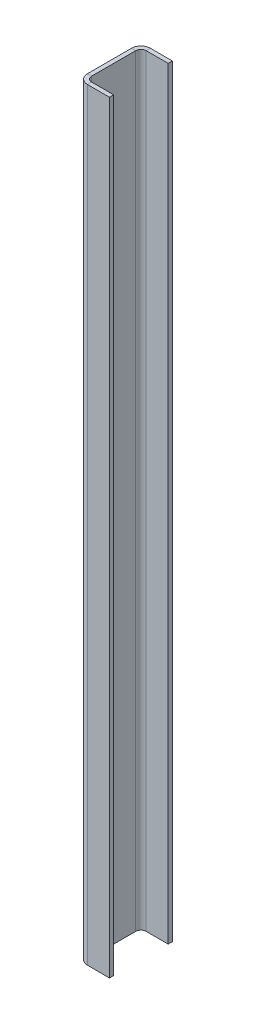
ISO-10303-21;
HEADER;
FILE_DESCRIPTION(('STEP AP214'),'2;1');
FILE_NAME('part.step','',(''),(''),'','','');
FILE_SCHEMA(('AUTOMOTIVE_DESIGN { 1 0 10303 214 1 1 1 1 }'));
ENDSEC;
DATA;
#1=APPLICATION_CONTEXT('core data for automotive mechanical design processes');
#2=APPLICATION_PROTOCOL_DEFINITION('international standard','automotive_design',2000,#1);
#3=PRODUCT_CONTEXT('',#1,'mechanical');
#4=PRODUCT('Part','Part','',(#3));
#5=PRODUCT_RELATED_PRODUCT_CATEGORY('part','',(#4));
#6=PRODUCT_DEFINITION_FORMATION('','',#4);
#7=PRODUCT_DEFINITION_CONTEXT('part definition',#1,'design');
#8=PRODUCT_DEFINITION('design','',#6,#7);
#9=PRODUCT_DEFINITION_SHAPE('','',#8);
#10=(LENGTH_UNIT() NAMED_UNIT(*) SI_UNIT(.MILLI.,.METRE.));
#11=(NAMED_UNIT(*) PLANE_ANGLE_UNIT() SI_UNIT($,.RADIAN.));
#12=(NAMED_UNIT(*) SI_UNIT($,.STERADIAN.) SOLID_ANGLE_UNIT());
#13=UNCERTAINTY_MEASURE_WITH_UNIT(LENGTH_MEASURE(1.E-05),#10,'distance_accuracy_value','');
#14=(GEOMETRIC_REPRESENTATION_CONTEXT(3) GLOBAL_UNCERTAINTY_ASSIGNED_CONTEXT((#13)) GLOBAL_UNIT_ASSIGNED_CONTEXT((#10,
#11,#12)) REPRESENTATION_CONTEXT('',''));
#15=CARTESIAN_POINT('',(0.,0.,0.));
#16=DIRECTION('',(0.,0.,1.));
#17=DIRECTION('',(1.,0.,0.));
#18=AXIS2_PLACEMENT_3D('',#15,#16,#17);
#19=CARTESIAN_POINT('',(-2.,0.,0.));
#20=DIRECTION('',(-1.,0.,0.));
#21=DIRECTION('',(0.,0.,1.));
#22=AXIS2_PLACEMENT_3D('',#19,#20,#21);
#23=PLANE('',#22);
#24=DIRECTION('',(0.,0.,-1.));
#25=VECTOR('',#24,1.);
#26=CARTESIAN_POINT('',(-2.,-182.,15.));
#27=LINE('',#26,#25);
#28=CARTESIAN_POINT('',(-2.00000000000001,-182.,10.5));
#29=VERTEX_POINT('',#28);
#30=CARTESIAN_POINT('',(-2.,-182.,-10.5));
#31=VERTEX_POINT('',#30);
#32=EDGE_CURVE('E13',#29,#31,#27,.T.);
#33=ORIENTED_EDGE('',*,*,#32,.F.);
#34=DIRECTION('',(0.,-1.,0.));
#35=VECTOR('',#34,1.);
#36=CARTESIAN_POINT('',(-2.00000000000001,-182.,10.5));
#37=LINE('',#36,#35);
#38=CARTESIAN_POINT('',(-2.,182.,10.5));
#39=VERTEX_POINT('',#38);
#40=EDGE_CURVE('E209',#29,#39,#37,.F.);
#41=ORIENTED_EDGE('',*,*,#40,.T.);
#42=DIRECTION('',(0.,0.,1.));
#43=VECTOR('',#42,1.);
#44=CARTESIAN_POINT('',(-2.,182.,15.));
#45=LINE('',#44,#43);
#46=CARTESIAN_POINT('',(-2.00000000000001,182.,-10.5));
#47=VERTEX_POINT('',#46);
#48=EDGE_CURVE('E86',#47,#39,#45,.T.);
#49=ORIENTED_EDGE('',*,*,#48,.F.);
#50=DIRECTION('',(0.,1.,0.));
#51=VECTOR('',#50,1.);
#52=CARTESIAN_POINT('',(-2.00000000000001,182.,-10.5));
#53=LINE('',#52,#51);
#54=EDGE_CURVE('E260',#47,#31,#53,.F.);
#55=ORIENTED_EDGE('',*,*,#54,.T.);
#56=EDGE_LOOP('',(#33,#41,#49,#55));
#57=FACE_BOUND('',#56,.T.);
#58=ADVANCED_FACE('F77',(#57),#23,.T.);
#59=CARTESIAN_POINT('',(0.,0.,0.));
#60=DIRECTION('',(-1.,0.,0.));
#61=DIRECTION('',(0.,0.,1.));
#62=AXIS2_PLACEMENT_3D('',#59,#60,#61);
#63=PLANE('',#62);
#64=DIRECTION('',(0.,-1.,0.));
#65=VECTOR('',#64,1.);
#66=CARTESIAN_POINT('',(0.,-182.,10.5));
#67=LINE('',#66,#65);
#68=CARTESIAN_POINT('',(0.,-182.,10.5));
#69=VERTEX_POINT('',#68);
#70=CARTESIAN_POINT('',(0.,182.,10.5));
#71=VERTEX_POINT('',#70);
#72=EDGE_CURVE('E220',#69,#71,#67,.F.);
#73=ORIENTED_EDGE('',*,*,#72,.F.);
#74=DIRECTION('',(0.,0.,-1.));
#75=VECTOR('',#74,1.);
#76=CARTESIAN_POINT('',(0.,-182.,15.));
#77=LINE('',#76,#75);
#78=CARTESIAN_POINT('',(0.,-182.,-10.5));
#79=VERTEX_POINT('',#78);
#80=EDGE_CURVE('E81',#69,#79,#77,.T.);
#81=ORIENTED_EDGE('',*,*,#80,.T.);
#82=DIRECTION('',(0.,1.,0.));
#83=VECTOR('',#82,1.);
#84=CARTESIAN_POINT('',(0.,182.,-10.5));
#85=LINE('',#84,#83);
#86=CARTESIAN_POINT('',(0.,182.,-10.5));
#87=VERTEX_POINT('',#86);
#88=EDGE_CURVE('E271',#87,#79,#85,.F.);
#89=ORIENTED_EDGE('',*,*,#88,.F.);
#90=DIRECTION('',(0.,0.,1.));
#91=VECTOR('',#90,1.);
#92=CARTESIAN_POINT('',(0.,182.,15.));
#93=LINE('',#92,#91);
#94=EDGE_CURVE('E277',#87,#71,#93,.T.);
#95=ORIENTED_EDGE('',*,*,#94,.T.);
#96=EDGE_LOOP('',(#73,#81,#89,#95));
#97=FACE_BOUND('',#96,.T.);
#98=ADVANCED_FACE('F289',(#97),#63,.F.);
#99=CARTESIAN_POINT('',(-2.,-182.,15.));
#100=DIRECTION('',(0.,-1.,0.));
#101=DIRECTION('',(0.,0.,-1.));
#102=AXIS2_PLACEMENT_3D('',#99,#100,#101);
#103=PLANE('',#102);
#104=ORIENTED_EDGE('',*,*,#80,.F.);
#105=DIRECTION('',(-1.,0.,0.));
#106=VECTOR('',#105,1.);
#107=CARTESIAN_POINT('',(0.,-182.,10.5));
#108=LINE('',#107,#106);
#109=EDGE_CURVE('E214',#69,#29,#108,.T.);
#110=ORIENTED_EDGE('',*,*,#109,.T.);
#111=ORIENTED_EDGE('',*,*,#32,.T.);
#112=DIRECTION('',(-1.,0.,0.));
#113=VECTOR('',#112,1.);
#114=CARTESIAN_POINT('',(0.,-182.,-10.5));
#115=LINE('',#114,#113);
#116=EDGE_CURVE('E275',#79,#31,#115,.T.);
#117=ORIENTED_EDGE('',*,*,#116,.F.);
#118=EDGE_LOOP('',(#104,#110,#111,#117));
#119=FACE_BOUND('',#118,.T.);
#120=ADVANCED_FACE('F291',(#119),#103,.T.);
#121=CARTESIAN_POINT('',(-2.,182.,15.));
#122=DIRECTION('',(0.,1.,0.));
#123=DIRECTION('',(0.,0.,1.));
#124=AXIS2_PLACEMENT_3D('',#121,#122,#123);
#125=PLANE('',#124);
#126=DIRECTION('',(-1.,0.,0.));
#127=VECTOR('',#126,1.);
#128=CARTESIAN_POINT('',(0.,182.,10.5));
#129=LINE('',#128,#127);
#130=EDGE_CURVE('E225',#71,#39,#129,.T.);
#131=ORIENTED_EDGE('',*,*,#130,.F.);
#132=ORIENTED_EDGE('',*,*,#94,.F.);
#133=DIRECTION('',(-1.,0.,0.));
#134=VECTOR('',#133,1.);
#135=CARTESIAN_POINT('',(0.,182.,-10.5));
#136=LINE('',#135,#134);
#137=EDGE_CURVE('E265',#87,#47,#136,.T.);
#138=ORIENTED_EDGE('',*,*,#137,.T.);
#139=ORIENTED_EDGE('',*,*,#48,.T.);
#140=EDGE_LOOP('',(#131,#132,#138,#139));
#141=FACE_BOUND('',#140,.T.);
#142=ADVANCED_FACE('F79',(#141),#125,.T.);
#143=CARTESIAN_POINT('',(2.49999999999999,-182.,-10.5));
#144=DIRECTION('',(0.,-1.,0.));
#145=DIRECTION('',(0.,0.,-1.));
#146=AXIS2_PLACEMENT_3D('',#143,#144,#145);
#147=PLANE('',#146);
#148=DIRECTION('',(0.,0.,1.));
#149=VECTOR('',#148,1.);
#150=CARTESIAN_POINT('',(2.49999999999999,-182.,-15.));
#151=LINE('',#150,#149);
#152=CARTESIAN_POINT('',(2.49999999999998,-182.,-13.));
#153=VERTEX_POINT('',#152);
#154=CARTESIAN_POINT('',(2.49999999999997,-182.,-15.));
#155=VERTEX_POINT('',#154);
#156=EDGE_CURVE('E227',#153,#155,#151,.F.);
#157=ORIENTED_EDGE('',*,*,#156,.F.);
#158=CARTESIAN_POINT('',(2.49999999999999,-182.,-10.5));
#159=DIRECTION('',(0.,1.,0.));
#160=DIRECTION('',(0.,0.,1.));
#161=AXIS2_PLACEMENT_3D('',#158,#159,#160);
#162=CIRCLE('',#161,2.5);
#163=EDGE_CURVE('E268',#79,#153,#162,.F.);
#164=ORIENTED_EDGE('',*,*,#163,.F.);
#165=ORIENTED_EDGE('',*,*,#116,.T.);
#166=CARTESIAN_POINT('',(2.49999999999999,-182.,-10.5));
#167=DIRECTION('',(0.,1.,0.));
#168=DIRECTION('',(0.,0.,1.));
#169=AXIS2_PLACEMENT_3D('',#166,#167,#168);
#170=CIRCLE('',#169,4.5);
#171=EDGE_CURVE('E94',#31,#155,#170,.F.);
#172=ORIENTED_EDGE('',*,*,#171,.T.);
#173=EDGE_LOOP('',(#157,#164,#165,#172));
#174=FACE_BOUND('',#173,.T.);
#175=ADVANCED_FACE('F295',(#174),#147,.T.);
#176=CARTESIAN_POINT('',(2.49999999999999,182.,-10.5));
#177=DIRECTION('',(0.,-1.,0.));
#178=DIRECTION('',(0.,0.,-1.));
#179=AXIS2_PLACEMENT_3D('',#176,#177,#178);
#180=PLANE('',#179);
#181=CARTESIAN_POINT('',(2.49999999999999,182.,-10.5));
#182=DIRECTION('',(0.,1.,0.));
#183=DIRECTION('',(0.,0.,1.));
#184=AXIS2_PLACEMENT_3D('',#181,#182,#183);
#185=CIRCLE('',#184,2.5);
#186=CARTESIAN_POINT('',(2.49999999999998,182.,-13.));
#187=VERTEX_POINT('',#186);
#188=EDGE_CURVE('E233',#187,#87,#185,.T.);
#189=ORIENTED_EDGE('',*,*,#188,.F.);
#190=DIRECTION('',(0.,0.,1.));
#191=VECTOR('',#190,1.);
#192=CARTESIAN_POINT('',(2.49999999999999,182.,-13.));
#193=LINE('',#192,#191);
#194=CARTESIAN_POINT('',(2.49999999999999,182.,-15.));
#195=VERTEX_POINT('',#194);
#196=EDGE_CURVE('E253',#187,#195,#193,.F.);
#197=ORIENTED_EDGE('',*,*,#196,.T.);
#198=CARTESIAN_POINT('',(2.49999999999999,182.,-10.5));
#199=DIRECTION('',(0.,1.,0.));
#200=DIRECTION('',(0.,0.,1.));
#201=AXIS2_PLACEMENT_3D('',#198,#199,#200);
#202=CIRCLE('',#201,4.5);
#203=EDGE_CURVE('E263',#195,#47,#202,.T.);
#204=ORIENTED_EDGE('',*,*,#203,.T.);
#205=ORIENTED_EDGE('',*,*,#137,.F.);
#206=EDGE_LOOP('',(#189,#197,#204,#205));
#207=FACE_BOUND('',#206,.T.);
#208=ADVANCED_FACE('F319',(#207),#180,.F.);
#209=CARTESIAN_POINT('',(2.49999999999999,182.,-10.5));
#210=DIRECTION('',(0.,1.,0.));
#211=DIRECTION('',(0.,0.,-1.));
#212=AXIS2_PLACEMENT_3D('',#209,#210,#211);
#213=CYLINDRICAL_SURFACE('',#212,4.5);
#214=ORIENTED_EDGE('',*,*,#54,.F.);
#215=ORIENTED_EDGE('',*,*,#203,.F.);
#216=DIRECTION('',(0.,1.,0.));
#217=VECTOR('',#216,1.);
#218=CARTESIAN_POINT('',(2.49999999999999,-182.,-15.));
#219=LINE('',#218,#217);
#220=EDGE_CURVE('E251',#195,#155,#219,.F.);
#221=ORIENTED_EDGE('',*,*,#220,.T.);
#222=ORIENTED_EDGE('',*,*,#171,.F.);
#223=EDGE_LOOP('',(#214,#215,#221,#222));
#224=FACE_BOUND('',#223,.T.);
#225=ADVANCED_FACE('F322',(#224),#213,.T.);
#226=CARTESIAN_POINT('',(2.49999999999999,182.,-10.5));
#227=DIRECTION('',(0.,1.,0.));
#228=DIRECTION('',(0.,0.,-1.));
#229=AXIS2_PLACEMENT_3D('',#226,#227,#228);
#230=CYLINDRICAL_SURFACE('',#229,2.5);
#231=ORIENTED_EDGE('',*,*,#88,.T.);
#232=ORIENTED_EDGE('',*,*,#163,.T.);
#233=DIRECTION('',(0.,1.,0.));
#234=VECTOR('',#233,1.);
#235=CARTESIAN_POINT('',(2.49999999999999,-182.,-13.));
#236=LINE('',#235,#234);
#237=EDGE_CURVE('E256',#153,#187,#236,.T.);
#238=ORIENTED_EDGE('',*,*,#237,.T.);
#239=ORIENTED_EDGE('',*,*,#188,.T.);
#240=EDGE_LOOP('',(#231,#232,#238,#239));
#241=FACE_BOUND('',#240,.T.);
#242=ADVANCED_FACE('F298',(#241),#230,.F.);
#243=CARTESIAN_POINT('',(13.,182.,-15.));
#244=DIRECTION('',(0.,-1.,0.));
#245=DIRECTION('',(0.,0.,-1.));
#246=AXIS2_PLACEMENT_3D('',#243,#244,#245);
#247=PLANE('',#246);
#248=ORIENTED_EDGE('',*,*,#196,.F.);
#249=DIRECTION('',(-1.,0.,0.));
#250=VECTOR('',#249,1.);
#251=CARTESIAN_POINT('',(13.,182.,-13.));
#252=LINE('',#251,#250);
#253=CARTESIAN_POINT('',(13.,182.,-13.));
#254=VERTEX_POINT('',#253);
#255=EDGE_CURVE('E249',#187,#254,#252,.F.);
#256=ORIENTED_EDGE('',*,*,#255,.T.);
#257=DIRECTION('',(0.,0.,1.));
#258=VECTOR('',#257,1.);
#259=CARTESIAN_POINT('',(13.,182.,-15.));
#260=LINE('',#259,#258);
#261=CARTESIAN_POINT('',(13.,182.,-15.));
#262=VERTEX_POINT('',#261);
#263=EDGE_CURVE('E230',#262,#254,#260,.T.);
#264=ORIENTED_EDGE('',*,*,#263,.F.);
#265=DIRECTION('',(1.,0.,0.));
#266=VECTOR('',#265,1.);
#267=CARTESIAN_POINT('',(0.,182.,-15.));
#268=LINE('',#267,#266);
#269=EDGE_CURVE('E242',#195,#262,#268,.T.);
#270=ORIENTED_EDGE('',*,*,#269,.F.);
#271=EDGE_LOOP('',(#248,#256,#264,#270));
#272=FACE_BOUND('',#271,.T.);
#273=ADVANCED_FACE('F316',(#272),#247,.F.);
#274=CARTESIAN_POINT('',(0.,-182.,-15.));
#275=DIRECTION('',(0.,1.,0.));
#276=DIRECTION('',(0.,0.,1.));
#277=AXIS2_PLACEMENT_3D('',#274,#275,#276);
#278=PLANE('',#277);
#279=ORIENTED_EDGE('',*,*,#156,.T.);
#280=DIRECTION('',(-1.,0.,0.));
#281=VECTOR('',#280,1.);
#282=CARTESIAN_POINT('',(0.,-182.,-15.));
#283=LINE('',#282,#281);
#284=CARTESIAN_POINT('',(13.,-182.,-15.));
#285=VERTEX_POINT('',#284);
#286=EDGE_CURVE('E237',#285,#155,#283,.T.);
#287=ORIENTED_EDGE('',*,*,#286,.F.);
#288=DIRECTION('',(0.,0.,1.));
#289=VECTOR('',#288,1.);
#290=CARTESIAN_POINT('',(13.,-182.,-15.));
#291=LINE('',#290,#289);
#292=CARTESIAN_POINT('',(13.,-182.,-13.));
#293=VERTEX_POINT('',#292);
#294=EDGE_CURVE('E234',#285,#293,#291,.T.);
#295=ORIENTED_EDGE('',*,*,#294,.T.);
#296=DIRECTION('',(1.,0.,0.));
#297=VECTOR('',#296,1.);
#298=CARTESIAN_POINT('',(0.,-182.,-13.));
#299=LINE('',#298,#297);
#300=EDGE_CURVE('E244',#293,#153,#299,.F.);
#301=ORIENTED_EDGE('',*,*,#300,.T.);
#302=EDGE_LOOP('',(#279,#287,#295,#301));
#303=FACE_BOUND('',#302,.T.);
#304=ADVANCED_FACE('F306',(#303),#278,.F.);
#305=CARTESIAN_POINT('',(0.,0.,-15.));
#306=DIRECTION('',(0.,0.,1.));
#307=DIRECTION('',(1.,0.,0.));
#308=AXIS2_PLACEMENT_3D('',#305,#306,#307);
#309=PLANE('',#308);
#310=ORIENTED_EDGE('',*,*,#220,.F.);
#311=ORIENTED_EDGE('',*,*,#269,.T.);
#312=DIRECTION('',(0.,-1.,0.));
#313=VECTOR('',#312,1.);
#314=CARTESIAN_POINT('',(13.,0.,-15.));
#315=LINE('',#314,#313);
#316=EDGE_CURVE('E240',#262,#285,#315,.T.);
#317=ORIENTED_EDGE('',*,*,#316,.T.);
#318=ORIENTED_EDGE('',*,*,#286,.T.);
#319=EDGE_LOOP('',(#310,#311,#317,#318));
#320=FACE_BOUND('',#319,.T.);
#321=ADVANCED_FACE('F321',(#320),#309,.F.);
#322=CARTESIAN_POINT('',(0.,0.,-13.));
#323=DIRECTION('',(0.,0.,1.));
#324=DIRECTION('',(1.,0.,0.));
#325=AXIS2_PLACEMENT_3D('',#322,#323,#324);
#326=PLANE('',#325);
#327=ORIENTED_EDGE('',*,*,#255,.F.);
#328=ORIENTED_EDGE('',*,*,#237,.F.);
#329=ORIENTED_EDGE('',*,*,#300,.F.);
#330=DIRECTION('',(0.,1.,0.));
#331=VECTOR('',#330,1.);
#332=CARTESIAN_POINT('',(13.,-182.,-13.));
#333=LINE('',#332,#331);
#334=EDGE_CURVE('E247',#254,#293,#333,.F.);
#335=ORIENTED_EDGE('',*,*,#334,.F.);
#336=EDGE_LOOP('',(#327,#328,#329,#335));
#337=FACE_BOUND('',#336,.T.);
#338=ADVANCED_FACE('F303',(#337),#326,.T.);
#339=CARTESIAN_POINT('',(13.,-182.,-15.));
#340=DIRECTION('',(-1.,0.,0.));
#341=DIRECTION('',(0.,0.,1.));
#342=AXIS2_PLACEMENT_3D('',#339,#340,#341);
#343=PLANE('',#342);
#344=ORIENTED_EDGE('',*,*,#334,.T.);
#345=ORIENTED_EDGE('',*,*,#294,.F.);
#346=ORIENTED_EDGE('',*,*,#316,.F.);
#347=ORIENTED_EDGE('',*,*,#263,.T.);
#348=EDGE_LOOP('',(#344,#345,#346,#347));
#349=FACE_BOUND('',#348,.T.);
#350=ADVANCED_FACE('F311',(#349),#343,.F.);
#351=CARTESIAN_POINT('',(2.49999999999999,182.,10.5));
#352=DIRECTION('',(0.,1.,0.));
#353=DIRECTION('',(0.,0.,1.));
#354=AXIS2_PLACEMENT_3D('',#351,#352,#353);
#355=PLANE('',#354);
#356=DIRECTION('',(0.,0.,-1.));
#357=VECTOR('',#356,1.);
#358=CARTESIAN_POINT('',(2.49999999999999,182.,15.));
#359=LINE('',#358,#357);
#360=CARTESIAN_POINT('',(2.49999999999998,182.,13.));
#361=VERTEX_POINT('',#360);
#362=CARTESIAN_POINT('',(2.49999999999998,182.,15.));
#363=VERTEX_POINT('',#362);
#364=EDGE_CURVE('E192',#361,#363,#359,.F.);
#365=ORIENTED_EDGE('',*,*,#364,.F.);
#366=CARTESIAN_POINT('',(2.49999999999999,182.,10.5));
#367=DIRECTION('',(0.,-1.,0.));
#368=DIRECTION('',(0.,0.,-1.));
#369=AXIS2_PLACEMENT_3D('',#366,#367,#368);
#370=CIRCLE('',#369,2.5);
#371=EDGE_CURVE('E217',#71,#361,#370,.F.);
#372=ORIENTED_EDGE('',*,*,#371,.F.);
#373=ORIENTED_EDGE('',*,*,#130,.T.);
#374=CARTESIAN_POINT('',(2.49999999999999,182.,10.5));
#375=DIRECTION('',(0.,-1.,0.));
#376=DIRECTION('',(0.,0.,-1.));
#377=AXIS2_PLACEMENT_3D('',#374,#375,#376);
#378=CIRCLE('',#377,4.5);
#379=EDGE_CURVE('E102',#39,#363,#378,.F.);
#380=ORIENTED_EDGE('',*,*,#379,.T.);
#381=EDGE_LOOP('',(#365,#372,#373,#380));
#382=FACE_BOUND('',#381,.T.);
#383=ADVANCED_FACE('F329',(#382),#355,.T.);
#384=CARTESIAN_POINT('',(2.49999999999999,-182.,10.5));
#385=DIRECTION('',(0.,1.,0.));
#386=DIRECTION('',(0.,0.,1.));
#387=AXIS2_PLACEMENT_3D('',#384,#385,#386);
#388=PLANE('',#387);
#389=CARTESIAN_POINT('',(2.49999999999999,-182.,10.5));
#390=DIRECTION('',(0.,-1.,0.));
#391=DIRECTION('',(0.,0.,-1.));
#392=AXIS2_PLACEMENT_3D('',#389,#390,#391);
#393=CIRCLE('',#392,2.5);
#394=CARTESIAN_POINT('',(2.49999999999998,-182.,13.));
#395=VERTEX_POINT('',#394);
#396=EDGE_CURVE('E222',#395,#69,#393,.T.);
#397=ORIENTED_EDGE('',*,*,#396,.F.);
#398=DIRECTION('',(0.,0.,-1.));
#399=VECTOR('',#398,1.);
#400=CARTESIAN_POINT('',(2.5,-182.,13.));
#401=LINE('',#400,#399);
#402=CARTESIAN_POINT('',(2.5,-182.,15.));
#403=VERTEX_POINT('',#402);
#404=EDGE_CURVE('E203',#395,#403,#401,.F.);
#405=ORIENTED_EDGE('',*,*,#404,.T.);
#406=CARTESIAN_POINT('',(2.49999999999999,-182.,10.5));
#407=DIRECTION('',(0.,-1.,0.));
#408=DIRECTION('',(0.,0.,-1.));
#409=AXIS2_PLACEMENT_3D('',#406,#407,#408);
#410=CIRCLE('',#409,4.5);
#411=EDGE_CURVE('E212',#403,#29,#410,.T.);
#412=ORIENTED_EDGE('',*,*,#411,.T.);
#413=ORIENTED_EDGE('',*,*,#109,.F.);
#414=EDGE_LOOP('',(#397,#405,#412,#413));
#415=FACE_BOUND('',#414,.T.);
#416=ADVANCED_FACE('F342',(#415),#388,.F.);
#417=CARTESIAN_POINT('',(2.49999999999999,-182.,10.5));
#418=DIRECTION('',(0.,-1.,0.));
#419=DIRECTION('',(0.,0.,1.));
#420=AXIS2_PLACEMENT_3D('',#417,#418,#419);
#421=CYLINDRICAL_SURFACE('',#420,4.5);
#422=ORIENTED_EDGE('',*,*,#40,.F.);
#423=ORIENTED_EDGE('',*,*,#411,.F.);
#424=DIRECTION('',(0.,-1.,0.));
#425=VECTOR('',#424,1.);
#426=CARTESIAN_POINT('',(2.49999999999999,182.,15.));
#427=LINE('',#426,#425);
#428=EDGE_CURVE('E201',#403,#363,#427,.F.);
#429=ORIENTED_EDGE('',*,*,#428,.T.);
#430=ORIENTED_EDGE('',*,*,#379,.F.);
#431=EDGE_LOOP('',(#422,#423,#429,#430));
#432=FACE_BOUND('',#431,.T.);
#433=ADVANCED_FACE('F343',(#432),#421,.T.);
#434=CARTESIAN_POINT('',(2.49999999999999,-182.,10.5));
#435=DIRECTION('',(0.,-1.,0.));
#436=DIRECTION('',(0.,0.,1.));
#437=AXIS2_PLACEMENT_3D('',#434,#435,#436);
#438=CYLINDRICAL_SURFACE('',#437,2.5);
#439=ORIENTED_EDGE('',*,*,#72,.T.);
#440=ORIENTED_EDGE('',*,*,#371,.T.);
#441=DIRECTION('',(0.,-1.,0.));
#442=VECTOR('',#441,1.);
#443=CARTESIAN_POINT('',(2.49999999999999,182.,13.));
#444=LINE('',#443,#442);
#445=EDGE_CURVE('E206',#361,#395,#444,.T.);
#446=ORIENTED_EDGE('',*,*,#445,.T.);
#447=ORIENTED_EDGE('',*,*,#396,.T.);
#448=EDGE_LOOP('',(#439,#440,#446,#447));
#449=FACE_BOUND('',#448,.T.);
#450=ADVANCED_FACE('F332',(#449),#438,.F.);
#451=CARTESIAN_POINT('',(0.,182.,15.));
#452=DIRECTION('',(0.,-1.,0.));
#453=DIRECTION('',(0.,0.,-1.));
#454=AXIS2_PLACEMENT_3D('',#451,#452,#453);
#455=PLANE('',#454);
#456=ORIENTED_EDGE('',*,*,#364,.T.);
#457=DIRECTION('',(-1.,0.,0.));
#458=VECTOR('',#457,1.);
#459=CARTESIAN_POINT('',(0.,182.,15.));
#460=LINE('',#459,#458);
#461=CARTESIAN_POINT('',(13.,182.,15.));
#462=VERTEX_POINT('',#461);
#463=EDGE_CURVE('E173',#462,#363,#460,.T.);
#464=ORIENTED_EDGE('',*,*,#463,.F.);
#465=DIRECTION('',(0.,0.,-1.));
#466=VECTOR('',#465,1.);
#467=CARTESIAN_POINT('',(13.,182.,15.));
#468=LINE('',#467,#466);
#469=CARTESIAN_POINT('',(13.,182.,13.));
#470=VERTEX_POINT('',#469);
#471=EDGE_CURVE('E179',#462,#470,#468,.T.);
#472=ORIENTED_EDGE('',*,*,#471,.T.);
#473=DIRECTION('',(1.,0.,0.));
#474=VECTOR('',#473,1.);
#475=CARTESIAN_POINT('',(0.,182.,13.));
#476=LINE('',#475,#474);
#477=EDGE_CURVE('E199',#470,#361,#476,.F.);
#478=ORIENTED_EDGE('',*,*,#477,.T.);
#479=EDGE_LOOP('',(#456,#464,#472,#478));
#480=FACE_BOUND('',#479,.T.);
#481=ADVANCED_FACE('F191',(#480),#455,.F.);
#482=CARTESIAN_POINT('',(13.,-182.,15.));
#483=DIRECTION('',(0.,1.,0.));
#484=DIRECTION('',(0.,0.,1.));
#485=AXIS2_PLACEMENT_3D('',#482,#483,#484);
#486=PLANE('',#485);
#487=ORIENTED_EDGE('',*,*,#404,.F.);
#488=DIRECTION('',(-1.,0.,0.));
#489=VECTOR('',#488,1.);
#490=CARTESIAN_POINT('',(13.,-182.,13.));
#491=LINE('',#490,#489);
#492=CARTESIAN_POINT('',(13.,-182.,13.));
#493=VERTEX_POINT('',#492);
#494=EDGE_CURVE('E195',#395,#493,#491,.F.);
#495=ORIENTED_EDGE('',*,*,#494,.T.);
#496=DIRECTION('',(0.,0.,-1.));
#497=VECTOR('',#496,1.);
#498=CARTESIAN_POINT('',(13.,-182.,15.));
#499=LINE('',#498,#497);
#500=CARTESIAN_POINT('',(13.,-182.,15.));
#501=VERTEX_POINT('',#500);
#502=EDGE_CURVE('E188',#501,#493,#499,.T.);
#503=ORIENTED_EDGE('',*,*,#502,.F.);
#504=DIRECTION('',(1.,0.,0.));
#505=VECTOR('',#504,1.);
#506=CARTESIAN_POINT('',(0.,-182.,15.));
#507=LINE('',#506,#505);
#508=EDGE_CURVE('E175',#403,#501,#507,.T.);
#509=ORIENTED_EDGE('',*,*,#508,.F.);
#510=EDGE_LOOP('',(#487,#495,#503,#509));
#511=FACE_BOUND('',#510,.T.);
#512=ADVANCED_FACE('F339',(#511),#486,.F.);
#513=CARTESIAN_POINT('',(0.,0.,15.));
#514=DIRECTION('',(0.,0.,-1.));
#515=DIRECTION('',(-1.,0.,0.));
#516=AXIS2_PLACEMENT_3D('',#513,#514,#515);
#517=PLANE('',#516);
#518=ORIENTED_EDGE('',*,*,#428,.F.);
#519=ORIENTED_EDGE('',*,*,#508,.T.);
#520=DIRECTION('',(0.,1.,0.));
#521=VECTOR('',#520,1.);
#522=CARTESIAN_POINT('',(13.,0.,15.));
#523=LINE('',#522,#521);
#524=EDGE_CURVE('E168',#501,#462,#523,.T.);
#525=ORIENTED_EDGE('',*,*,#524,.T.);
#526=ORIENTED_EDGE('',*,*,#463,.T.);
#527=EDGE_LOOP('',(#518,#519,#525,#526));
#528=FACE_BOUND('',#527,.T.);
#529=ADVANCED_FACE('F171',(#528),#517,.F.);
#530=CARTESIAN_POINT('',(0.,0.,13.));
#531=DIRECTION('',(0.,0.,-1.));
#532=DIRECTION('',(-1.,0.,0.));
#533=AXIS2_PLACEMENT_3D('',#530,#531,#532);
#534=PLANE('',#533);
#535=ORIENTED_EDGE('',*,*,#494,.F.);
#536=ORIENTED_EDGE('',*,*,#445,.F.);
#537=ORIENTED_EDGE('',*,*,#477,.F.);
#538=DIRECTION('',(0.,-1.,0.));
#539=VECTOR('',#538,1.);
#540=CARTESIAN_POINT('',(13.,182.,13.));
#541=LINE('',#540,#539);
#542=EDGE_CURVE('E184',#493,#470,#541,.F.);
#543=ORIENTED_EDGE('',*,*,#542,.F.);
#544=EDGE_LOOP('',(#535,#536,#537,#543));
#545=FACE_BOUND('',#544,.T.);
#546=ADVANCED_FACE('F336',(#545),#534,.T.);
#547=CARTESIAN_POINT('',(13.,182.,15.));
#548=DIRECTION('',(-1.,0.,0.));
#549=DIRECTION('',(0.,0.,1.));
#550=AXIS2_PLACEMENT_3D('',#547,#548,#549);
#551=PLANE('',#550);
#552=ORIENTED_EDGE('',*,*,#542,.T.);
#553=ORIENTED_EDGE('',*,*,#471,.F.);
#554=ORIENTED_EDGE('',*,*,#524,.F.);
#555=ORIENTED_EDGE('',*,*,#502,.T.);
#556=EDGE_LOOP('',(#552,#553,#554,#555));
#557=FACE_BOUND('',#556,.T.);
#558=ADVANCED_FACE('F182',(#557),#551,.F.);
#559=CLOSED_SHELL('',(#58,#98,#120,#142,#175,#208,#225,#242,#273,#304,#321,#338,#350,#383,#416,
#433,#450,#481,#512,#529,#546,#558));
#560=MANIFOLD_SOLID_BREP('B2',#559);
#561=ADVANCED_BREP_SHAPE_REPRESENTATION('',(#18,#560),#14);
#562=SHAPE_DEFINITION_REPRESENTATION(#9,#561);
ENDSEC;
END-ISO-10303-21;
